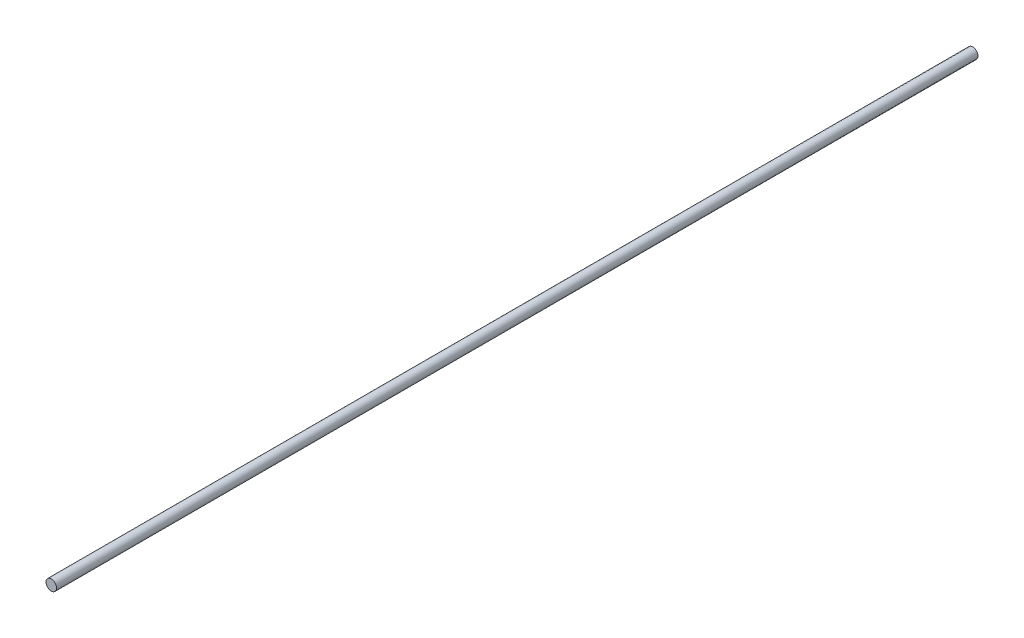
ISO-10303-21;
HEADER;
FILE_DESCRIPTION(('STEP AP214'),'2;1');
FILE_NAME('part.step','',(''),(''),'','','');
FILE_SCHEMA(('AUTOMOTIVE_DESIGN { 1 0 10303 214 1 1 1 1 }'));
ENDSEC;
DATA;
#1=APPLICATION_CONTEXT('core data for automotive mechanical design processes');
#2=APPLICATION_PROTOCOL_DEFINITION('international standard','automotive_design',2000,#1);
#3=PRODUCT_CONTEXT('',#1,'mechanical');
#4=PRODUCT('Part','Part','',(#3));
#5=PRODUCT_RELATED_PRODUCT_CATEGORY('part','',(#4));
#6=PRODUCT_DEFINITION_FORMATION('','',#4);
#7=PRODUCT_DEFINITION_CONTEXT('part definition',#1,'design');
#8=PRODUCT_DEFINITION('design','',#6,#7);
#9=PRODUCT_DEFINITION_SHAPE('','',#8);
#10=(LENGTH_UNIT() NAMED_UNIT(*) SI_UNIT(.MILLI.,.METRE.));
#11=(NAMED_UNIT(*) PLANE_ANGLE_UNIT() SI_UNIT($,.RADIAN.));
#12=(NAMED_UNIT(*) SI_UNIT($,.STERADIAN.) SOLID_ANGLE_UNIT());
#13=UNCERTAINTY_MEASURE_WITH_UNIT(LENGTH_MEASURE(1.E-05),#10,'distance_accuracy_value','');
#14=(GEOMETRIC_REPRESENTATION_CONTEXT(3) GLOBAL_UNCERTAINTY_ASSIGNED_CONTEXT((#13)) GLOBAL_UNIT_ASSIGNED_CONTEXT((#10,
#11,#12)) REPRESENTATION_CONTEXT('',''));
#15=CARTESIAN_POINT('',(0.,0.,0.));
#16=DIRECTION('',(0.,0.,1.));
#17=DIRECTION('',(1.,0.,0.));
#18=AXIS2_PLACEMENT_3D('',#15,#16,#17);
#19=CARTESIAN_POINT('',(0.,0.,700.));
#20=DIRECTION('',(0.,0.,-1.));
#21=DIRECTION('',(-1.,0.,0.));
#22=AXIS2_PLACEMENT_3D('',#19,#20,#21);
#23=CYLINDRICAL_SURFACE('',#22,4.);
#24=CARTESIAN_POINT('',(0.,0.,700.));
#25=DIRECTION('',(0.,0.,1.));
#26=DIRECTION('',(1.,0.,0.));
#27=AXIS2_PLACEMENT_3D('',#24,#25,#26);
#28=CIRCLE('',#27,4.);
#29=CARTESIAN_POINT('',(4.,0.,700.));
#30=VERTEX_POINT('',#29);
#31=EDGE_CURVE('E10',#30,#30,#28,.T.);
#32=ORIENTED_EDGE('',*,*,#31,.F.);
#33=EDGE_LOOP('',(#32));
#34=FACE_BOUND('',#33,.T.);
#35=CARTESIAN_POINT('',(0.,0.,0.));
#36=DIRECTION('',(0.,0.,1.));
#37=DIRECTION('',(1.,0.,0.));
#38=AXIS2_PLACEMENT_3D('',#35,#36,#37);
#39=CIRCLE('',#38,4.);
#40=CARTESIAN_POINT('',(4.,0.,0.));
#41=VERTEX_POINT('',#40);
#42=EDGE_CURVE('E37',#41,#41,#39,.T.);
#43=ORIENTED_EDGE('',*,*,#42,.T.);
#44=EDGE_LOOP('',(#43));
#45=FACE_BOUND('',#44,.T.);
#46=ADVANCED_FACE('F34',(#34,#45),#23,.T.);
#47=CARTESIAN_POINT('',(0.,0.,700.));
#48=DIRECTION('',(0.,0.,1.));
#49=DIRECTION('',(1.,0.,0.));
#50=AXIS2_PLACEMENT_3D('',#47,#48,#49);
#51=PLANE('',#50);
#52=ORIENTED_EDGE('',*,*,#31,.T.);
#53=EDGE_LOOP('',(#52));
#54=FACE_BOUND('',#53,.T.);
#55=ADVANCED_FACE('F49',(#54),#51,.T.);
#56=CARTESIAN_POINT('',(0.,0.,0.));
#57=DIRECTION('',(0.,0.,1.));
#58=DIRECTION('',(1.,0.,0.));
#59=AXIS2_PLACEMENT_3D('',#56,#57,#58);
#60=PLANE('',#59);
#61=ORIENTED_EDGE('',*,*,#42,.F.);
#62=EDGE_LOOP('',(#61));
#63=FACE_BOUND('',#62,.T.);
#64=ADVANCED_FACE('F47',(#63),#60,.F.);
#65=CLOSED_SHELL('',(#46,#55,#64));
#66=MANIFOLD_SOLID_BREP('B2',#65);
#67=ADVANCED_BREP_SHAPE_REPRESENTATION('',(#18,#66),#14);
#68=SHAPE_DEFINITION_REPRESENTATION(#9,#67);
ENDSEC;
END-ISO-10303-21;
